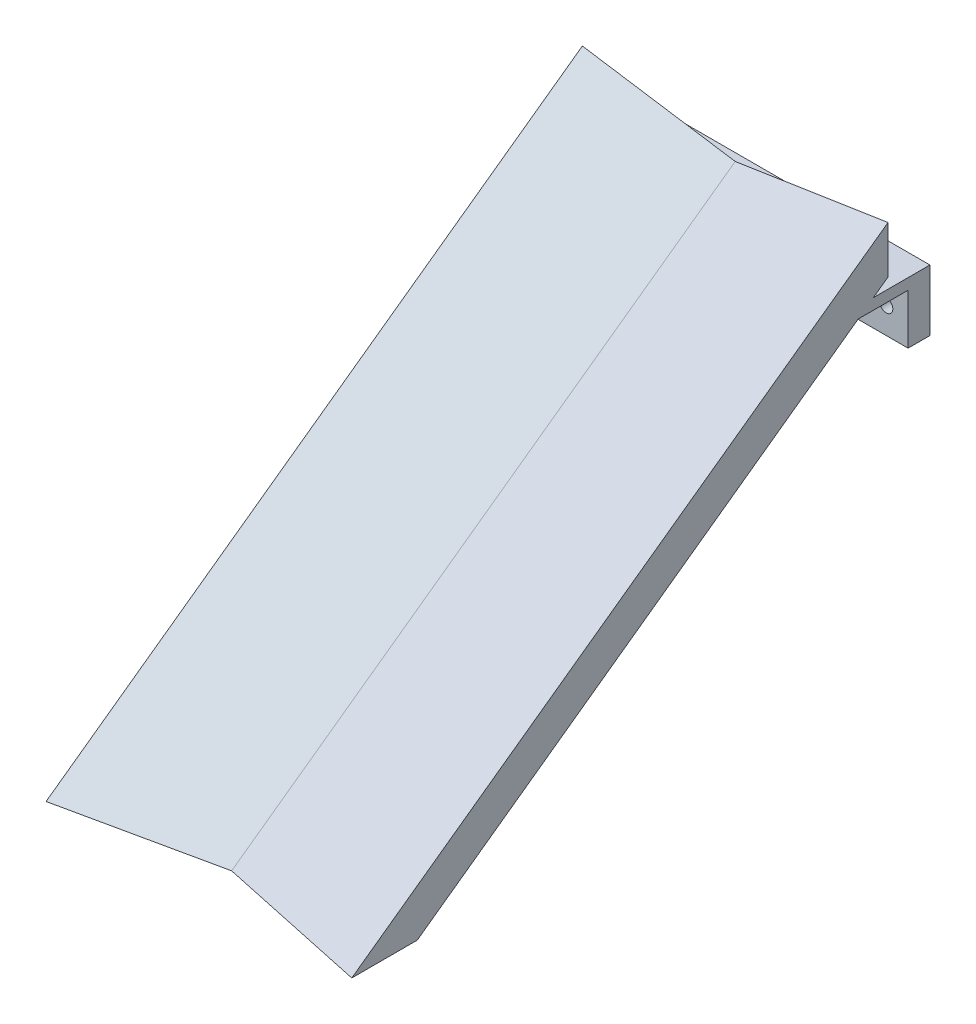
ISO-10303-21;
HEADER;
FILE_DESCRIPTION(('STEP AP214'),'2;1');
FILE_NAME('part.step','',(''),(''),'','','');
FILE_SCHEMA(('AUTOMOTIVE_DESIGN { 1 0 10303 214 1 1 1 1 }'));
ENDSEC;
DATA;
#1=APPLICATION_CONTEXT('core data for automotive mechanical design processes');
#2=APPLICATION_PROTOCOL_DEFINITION('international standard','automotive_design',2000,#1);
#3=PRODUCT_CONTEXT('',#1,'mechanical');
#4=PRODUCT('Part','Part','',(#3));
#5=PRODUCT_RELATED_PRODUCT_CATEGORY('part','',(#4));
#6=PRODUCT_DEFINITION_FORMATION('','',#4);
#7=PRODUCT_DEFINITION_CONTEXT('part definition',#1,'design');
#8=PRODUCT_DEFINITION('design','',#6,#7);
#9=PRODUCT_DEFINITION_SHAPE('','',#8);
#10=(LENGTH_UNIT() NAMED_UNIT(*) SI_UNIT(.MILLI.,.METRE.));
#11=(NAMED_UNIT(*) PLANE_ANGLE_UNIT() SI_UNIT($,.RADIAN.));
#12=(NAMED_UNIT(*) SI_UNIT($,.STERADIAN.) SOLID_ANGLE_UNIT());
#13=UNCERTAINTY_MEASURE_WITH_UNIT(LENGTH_MEASURE(1.E-05),#10,'distance_accuracy_value','');
#14=(GEOMETRIC_REPRESENTATION_CONTEXT(3) GLOBAL_UNCERTAINTY_ASSIGNED_CONTEXT((#13)) GLOBAL_UNIT_ASSIGNED_CONTEXT((#10,
#11,#12)) REPRESENTATION_CONTEXT('',''));
#15=CARTESIAN_POINT('',(0.,0.,0.));
#16=DIRECTION('',(0.,0.,1.));
#17=DIRECTION('',(1.,0.,0.));
#18=AXIS2_PLACEMENT_3D('',#15,#16,#17);
#19=CARTESIAN_POINT('',(-9.99999999999998,0.,220.));
#20=DIRECTION('',(0.,0.811534341451494,0.584304725845076));
#21=DIRECTION('',(0.,-0.584304725845076,0.811534341451494));
#22=AXIS2_PLACEMENT_3D('',#19,#20,#21);
#23=PLANE('',#22);
#24=DIRECTION('',(0.,0.584304725845076,-0.811534341451494));
#25=VECTOR('',#24,1.);
#26=CARTESIAN_POINT('',(0.,104.32033719705,75.1106427818757));
#27=LINE('',#26,#25);
#28=CARTESIAN_POINT('',(0.,150.4,11.1111111111112));
#29=VERTEX_POINT('',#28);
#30=CARTESIAN_POINT('',(0.,155.244637012322,4.38244859399657));
#31=VERTEX_POINT('',#30);
#32=EDGE_CURVE('E217',#29,#31,#27,.T.);
#33=ORIENTED_EDGE('',*,*,#32,.T.);
#34=DIRECTION('',(1.,0.,0.));
#35=VECTOR('',#34,1.);
#36=CARTESIAN_POINT('',(-40.0000000000001,155.244637012322,4.38244859399657));
#37=LINE('',#36,#35);
#38=CARTESIAN_POINT('',(140.,155.244637012322,4.38244859399657));
#39=VERTEX_POINT('',#38);
#40=EDGE_CURVE('E200',#31,#39,#37,.T.);
#41=ORIENTED_EDGE('',*,*,#40,.T.);
#42=DIRECTION('',(0.,-0.584304725845076,0.811534341451494));
#43=VECTOR('',#42,1.);
#44=CARTESIAN_POINT('',(140.,0.,220.));
#45=LINE('',#44,#43);
#46=CARTESIAN_POINT('',(140.,150.4,11.111111111111));
#47=VERTEX_POINT('',#46);
#48=EDGE_CURVE('E209',#39,#47,#45,.T.);
#49=ORIENTED_EDGE('',*,*,#48,.T.);
#50=DIRECTION('',(-1.,0.,0.));
#51=VECTOR('',#50,1.);
#52=CARTESIAN_POINT('',(140.,150.4,11.1111111111112));
#53=LINE('',#52,#51);
#54=EDGE_CURVE('E249',#47,#29,#53,.T.);
#55=ORIENTED_EDGE('',*,*,#54,.T.);
#56=EDGE_LOOP('',(#33,#41,#49,#55));
#57=FACE_BOUND('',#56,.T.);
#58=ADVANCED_FACE('F110',(#57),#23,.F.);
#59=CARTESIAN_POINT('',(140.,0.,0.));
#60=DIRECTION('',(0.,1.,0.));
#61=DIRECTION('',(0.,0.,1.));
#62=AXIS2_PLACEMENT_3D('',#59,#60,#61);
#63=PLANE('',#62);
#64=DIRECTION('',(-0.97780241407741,0.,-0.209529088730873));
#65=VECTOR('',#64,1.);
#66=CARTESIAN_POINT('',(20.8042090518905,0.,224.458044796834));
#67=LINE('',#66,#65);
#68=CARTESIAN_POINT('',(140.,0.,250.));
#69=VERTEX_POINT('',#68);
#70=CARTESIAN_POINT('',(70.,0.,235.));
#71=VERTEX_POINT('',#70);
#72=EDGE_CURVE('E214',#69,#71,#67,.T.);
#73=ORIENTED_EDGE('',*,*,#72,.T.);
#74=DIRECTION('',(0.97780241407741,0.,-0.209529088730873));
#75=VECTOR('',#74,1.);
#76=CARTESIAN_POINT('',(119.19579094811,0.,224.458044796834));
#77=LINE('',#76,#75);
#78=CARTESIAN_POINT('',(0.,0.,250.));
#79=VERTEX_POINT('',#78);
#80=EDGE_CURVE('E269',#79,#71,#77,.T.);
#81=ORIENTED_EDGE('',*,*,#80,.F.);
#82=DIRECTION('',(0.,0.,-1.));
#83=VECTOR('',#82,1.);
#84=CARTESIAN_POINT('',(0.,0.,0.));
#85=LINE('',#84,#83);
#86=CARTESIAN_POINT('',(0.,0.,220.));
#87=VERTEX_POINT('',#86);
#88=EDGE_CURVE('E227',#79,#87,#85,.T.);
#89=ORIENTED_EDGE('',*,*,#88,.T.);
#90=DIRECTION('',(1.,0.,0.));
#91=VECTOR('',#90,1.);
#92=CARTESIAN_POINT('',(-9.99999999999998,0.,220.));
#93=LINE('',#92,#91);
#94=CARTESIAN_POINT('',(140.,0.,220.));
#95=VERTEX_POINT('',#94);
#96=EDGE_CURVE('E231',#87,#95,#93,.T.);
#97=ORIENTED_EDGE('',*,*,#96,.T.);
#98=DIRECTION('',(0.,0.,-1.));
#99=VECTOR('',#98,1.);
#100=CARTESIAN_POINT('',(140.,0.,0.));
#101=LINE('',#100,#99);
#102=EDGE_CURVE('E218',#69,#95,#101,.T.);
#103=ORIENTED_EDGE('',*,*,#102,.F.);
#104=EDGE_LOOP('',(#73,#81,#89,#97,#103));
#105=FACE_BOUND('',#104,.T.);
#106=ADVANCED_FACE('F112',(#105),#63,.F.);
#107=CARTESIAN_POINT('',(140.,0.,0.));
#108=DIRECTION('',(-1.,0.,0.));
#109=DIRECTION('',(0.,0.,1.));
#110=AXIS2_PLACEMENT_3D('',#107,#108,#109);
#111=PLANE('',#110);
#112=ORIENTED_EDGE('',*,*,#48,.F.);
#113=DIRECTION('',(0.,-1.,0.));
#114=VECTOR('',#113,1.);
#115=CARTESIAN_POINT('',(140.,176.844637012322,4.38244859399658));
#116=LINE('',#115,#114);
#117=CARTESIAN_POINT('',(140.,176.844637012322,4.38244859399658));
#118=VERTEX_POINT('',#117);
#119=EDGE_CURVE('E194',#118,#39,#116,.T.);
#120=ORIENTED_EDGE('',*,*,#119,.F.);
#121=DIRECTION('',(0.,-0.584304725845076,0.811534341451494));
#122=VECTOR('',#121,1.);
#123=CARTESIAN_POINT('',(140.,0.,250.));
#124=LINE('',#123,#122);
#125=EDGE_CURVE('E206',#118,#69,#124,.T.);
#126=ORIENTED_EDGE('',*,*,#125,.T.);
#127=ORIENTED_EDGE('',*,*,#102,.T.);
#128=CARTESIAN_POINT('',(140.,145.4,18.0555555555556));
#129=VERTEX_POINT('',#128);
#130=EDGE_CURVE('E291',#129,#95,#45,.T.);
#131=ORIENTED_EDGE('',*,*,#130,.F.);
#132=DIRECTION('',(0.,0.,1.));
#133=VECTOR('',#132,1.);
#134=CARTESIAN_POINT('',(140.,145.4,-4.79552373042697));
#135=LINE('',#134,#133);
#136=CARTESIAN_POINT('',(140.,145.4,-4.79552373042697));
#137=VERTEX_POINT('',#136);
#138=EDGE_CURVE('E247',#137,#129,#135,.T.);
#139=ORIENTED_EDGE('',*,*,#138,.F.);
#140=DIRECTION('',(0.,1.,0.));
#141=VECTOR('',#140,1.);
#142=CARTESIAN_POINT('',(140.,122.4,-4.79552373042697));
#143=LINE('',#142,#141);
#144=CARTESIAN_POINT('',(140.,122.4,-4.79552373042697));
#145=VERTEX_POINT('',#144);
#146=EDGE_CURVE('E301',#145,#137,#143,.T.);
#147=ORIENTED_EDGE('',*,*,#146,.F.);
#148=DIRECTION('',(0.,0.,1.));
#149=VECTOR('',#148,1.);
#150=CARTESIAN_POINT('',(140.,122.4,-14.795523730427));
#151=LINE('',#150,#149);
#152=CARTESIAN_POINT('',(140.,122.4,-14.795523730427));
#153=VERTEX_POINT('',#152);
#154=EDGE_CURVE('E304',#153,#145,#151,.T.);
#155=ORIENTED_EDGE('',*,*,#154,.F.);
#156=DIRECTION('',(0.,-1.,0.));
#157=VECTOR('',#156,1.);
#158=CARTESIAN_POINT('',(140.,150.4,-14.795523730427));
#159=LINE('',#158,#157);
#160=CARTESIAN_POINT('',(140.,150.4,-14.795523730427));
#161=VERTEX_POINT('',#160);
#162=EDGE_CURVE('E308',#161,#153,#159,.T.);
#163=ORIENTED_EDGE('',*,*,#162,.F.);
#164=DIRECTION('',(0.,0.,-1.));
#165=VECTOR('',#164,1.);
#166=CARTESIAN_POINT('',(140.,150.4,-4.79552373042697));
#167=LINE('',#166,#165);
#168=EDGE_CURVE('E261',#47,#161,#167,.T.);
#169=ORIENTED_EDGE('',*,*,#168,.F.);
#170=EDGE_LOOP('',(#112,#120,#126,#127,#131,#139,#147,#155,#163,#169));
#171=FACE_BOUND('',#170,.T.);
#172=ADVANCED_FACE('F204',(#171),#111,.F.);
#173=CARTESIAN_POINT('',(0.,0.,0.));
#174=DIRECTION('',(-1.,0.,0.));
#175=DIRECTION('',(0.,0.,1.));
#176=AXIS2_PLACEMENT_3D('',#173,#174,#175);
#177=PLANE('',#176);
#178=DIRECTION('',(0.,1.,0.));
#179=VECTOR('',#178,1.);
#180=CARTESIAN_POINT('',(0.,0.,4.38244859399649));
#181=LINE('',#180,#179);
#182=CARTESIAN_POINT('',(0.,176.844637012322,4.38244859399656));
#183=VERTEX_POINT('',#182);
#184=EDGE_CURVE('E126',#31,#183,#181,.T.);
#185=ORIENTED_EDGE('',*,*,#184,.F.);
#186=ORIENTED_EDGE('',*,*,#32,.F.);
#187=DIRECTION('',(0.,0.,-1.));
#188=VECTOR('',#187,1.);
#189=CARTESIAN_POINT('',(0.,150.4,-4.79552373042697));
#190=LINE('',#189,#188);
#191=CARTESIAN_POINT('',(0.,150.4,-14.795523730427));
#192=VERTEX_POINT('',#191);
#193=EDGE_CURVE('E257',#29,#192,#190,.T.);
#194=ORIENTED_EDGE('',*,*,#193,.T.);
#195=DIRECTION('',(0.,-1.,0.));
#196=VECTOR('',#195,1.);
#197=CARTESIAN_POINT('',(0.,150.4,-14.795523730427));
#198=LINE('',#197,#196);
#199=CARTESIAN_POINT('',(0.,122.4,-14.795523730427));
#200=VERTEX_POINT('',#199);
#201=EDGE_CURVE('E321',#192,#200,#198,.T.);
#202=ORIENTED_EDGE('',*,*,#201,.T.);
#203=DIRECTION('',(0.,0.,1.));
#204=VECTOR('',#203,1.);
#205=CARTESIAN_POINT('',(0.,122.4,-14.795523730427));
#206=LINE('',#205,#204);
#207=CARTESIAN_POINT('',(0.,122.4,-4.79552373042697));
#208=VERTEX_POINT('',#207);
#209=EDGE_CURVE('E263',#200,#208,#206,.T.);
#210=ORIENTED_EDGE('',*,*,#209,.T.);
#211=DIRECTION('',(0.,1.,0.));
#212=VECTOR('',#211,1.);
#213=CARTESIAN_POINT('',(0.,122.4,-4.79552373042697));
#214=LINE('',#213,#212);
#215=CARTESIAN_POINT('',(0.,145.4,-4.79552373042697));
#216=VERTEX_POINT('',#215);
#217=EDGE_CURVE('E255',#208,#216,#214,.T.);
#218=ORIENTED_EDGE('',*,*,#217,.T.);
#219=DIRECTION('',(0.,0.,1.));
#220=VECTOR('',#219,1.);
#221=CARTESIAN_POINT('',(0.,145.4,-4.79552373042697));
#222=LINE('',#221,#220);
#223=CARTESIAN_POINT('',(0.,145.4,18.0555555555556));
#224=VERTEX_POINT('',#223);
#225=EDGE_CURVE('E244',#216,#224,#222,.T.);
#226=ORIENTED_EDGE('',*,*,#225,.T.);
#227=EDGE_CURVE('E119',#87,#224,#27,.T.);
#228=ORIENTED_EDGE('',*,*,#227,.F.);
#229=ORIENTED_EDGE('',*,*,#88,.F.);
#230=DIRECTION('',(0.,-0.584304725845076,0.811534341451494));
#231=VECTOR('',#230,1.);
#232=CARTESIAN_POINT('',(0.,0.,250.));
#233=LINE('',#232,#231);
#234=EDGE_CURVE('E223',#183,#79,#233,.T.);
#235=ORIENTED_EDGE('',*,*,#234,.F.);
#236=EDGE_LOOP('',(#185,#186,#194,#202,#210,#218,#226,#228,#229,#235));
#237=FACE_BOUND('',#236,.T.);
#238=ADVANCED_FACE('F252',(#237),#177,.T.);
#239=ORIENTED_EDGE('',*,*,#227,.T.);
#240=DIRECTION('',(-1.,0.,0.));
#241=VECTOR('',#240,1.);
#242=CARTESIAN_POINT('',(140.,145.4,18.0555555555556));
#243=LINE('',#242,#241);
#244=EDGE_CURVE('E133',#129,#224,#243,.T.);
#245=ORIENTED_EDGE('',*,*,#244,.F.);
#246=ORIENTED_EDGE('',*,*,#130,.T.);
#247=ORIENTED_EDGE('',*,*,#96,.F.);
#248=EDGE_LOOP('',(#239,#245,#246,#247));
#249=FACE_BOUND('',#248,.T.);
#250=ADVANCED_FACE('F235',(#249),#23,.F.);
#251=CARTESIAN_POINT('',(70.,172.888065331928,-5.12231296101159));
#252=DIRECTION('',(-0.124238097241817,0.805246926567333,0.57977778712848));
#253=DIRECTION('',(0.,-0.584304725845076,0.811534341451494));
#254=AXIS2_PLACEMENT_3D('',#251,#252,#253);
#255=PLANE('',#254);
#256=DIRECTION('',(0.988306317934771,0.15248154619565,0.));
#257=VECTOR('',#256,1.);
#258=CARTESIAN_POINT('',(71.0312942147776,166.203750976888,4.38244859399657));
#259=LINE('',#258,#257);
#260=CARTESIAN_POINT('',(70.,166.044637012322,4.38244859399657));
#261=VERTEX_POINT('',#260);
#262=EDGE_CURVE('E191',#261,#118,#259,.T.);
#263=ORIENTED_EDGE('',*,*,#262,.F.);
#264=DIRECTION('',(0.,-0.584304725845076,0.811534341451494));
#265=VECTOR('',#264,1.);
#266=CARTESIAN_POINT('',(70.,172.888065331928,-5.12231296101159));
#267=LINE('',#266,#265);
#268=EDGE_CURVE('E288',#261,#71,#267,.T.);
#269=ORIENTED_EDGE('',*,*,#268,.T.);
#270=ORIENTED_EDGE('',*,*,#72,.F.);
#271=ORIENTED_EDGE('',*,*,#125,.F.);
#272=EDGE_LOOP('',(#263,#269,#270,#271));
#273=FACE_BOUND('',#272,.T.);
#274=ADVANCED_FACE('F212',(#273),#255,.T.);
#275=CARTESIAN_POINT('',(70.,172.888065331928,-5.12231296101159));
#276=DIRECTION('',(-0.124238097241817,-0.805246926567333,-0.57977778712848));
#277=DIRECTION('',(0.,0.584304725845076,-0.811534341451494));
#278=AXIS2_PLACEMENT_3D('',#275,#276,#277);
#279=PLANE('',#278);
#280=ORIENTED_EDGE('',*,*,#268,.F.);
#281=DIRECTION('',(-0.988306317934771,0.15248154619565,0.));
#282=VECTOR('',#281,1.);
#283=CARTESIAN_POINT('',(68.9687057852224,166.203750976888,4.38244859399657));
#284=LINE('',#283,#282);
#285=EDGE_CURVE('E57',#261,#183,#284,.T.);
#286=ORIENTED_EDGE('',*,*,#285,.T.);
#287=ORIENTED_EDGE('',*,*,#234,.T.);
#288=ORIENTED_EDGE('',*,*,#80,.T.);
#289=EDGE_LOOP('',(#280,#286,#287,#288));
#290=FACE_BOUND('',#289,.T.);
#291=ADVANCED_FACE('F387',(#290),#279,.F.);
#292=CARTESIAN_POINT('',(140.,150.4,-4.79552373042697));
#293=DIRECTION('',(0.,1.,0.));
#294=DIRECTION('',(0.,0.,1.));
#295=AXIS2_PLACEMENT_3D('',#292,#293,#294);
#296=PLANE('',#295);
#297=ORIENTED_EDGE('',*,*,#193,.F.);
#298=ORIENTED_EDGE('',*,*,#54,.F.);
#299=ORIENTED_EDGE('',*,*,#168,.T.);
#300=DIRECTION('',(-1.,0.,0.));
#301=VECTOR('',#300,1.);
#302=CARTESIAN_POINT('',(140.,150.4,-14.795523730427));
#303=LINE('',#302,#301);
#304=EDGE_CURVE('E279',#161,#192,#303,.T.);
#305=ORIENTED_EDGE('',*,*,#304,.T.);
#306=EDGE_LOOP('',(#297,#298,#299,#305));
#307=FACE_BOUND('',#306,.T.);
#308=ADVANCED_FACE('F337',(#307),#296,.T.);
#309=CARTESIAN_POINT('',(140.,145.4,-4.79552373042697));
#310=DIRECTION('',(0.,-1.,0.));
#311=DIRECTION('',(0.,0.,-1.));
#312=AXIS2_PLACEMENT_3D('',#309,#310,#311);
#313=PLANE('',#312);
#314=ORIENTED_EDGE('',*,*,#225,.F.);
#315=DIRECTION('',(-1.,0.,0.));
#316=VECTOR('',#315,1.);
#317=CARTESIAN_POINT('',(140.,145.4,-4.79552373042697));
#318=LINE('',#317,#316);
#319=EDGE_CURVE('E250',#137,#216,#318,.T.);
#320=ORIENTED_EDGE('',*,*,#319,.F.);
#321=ORIENTED_EDGE('',*,*,#138,.T.);
#322=ORIENTED_EDGE('',*,*,#244,.T.);
#323=EDGE_LOOP('',(#314,#320,#321,#322));
#324=FACE_BOUND('',#323,.T.);
#325=ADVANCED_FACE('F243',(#324),#313,.T.);
#326=CARTESIAN_POINT('',(140.,122.4,-4.79552373042697));
#327=DIRECTION('',(0.,0.,1.));
#328=DIRECTION('',(1.,0.,0.));
#329=AXIS2_PLACEMENT_3D('',#326,#327,#328);
#330=PLANE('',#329);
#331=CARTESIAN_POINT('',(130.,134.4,-4.79552373042696));
#332=DIRECTION('',(0.,0.,-1.));
#333=DIRECTION('',(-1.,0.,0.));
#334=AXIS2_PLACEMENT_3D('',#331,#332,#333);
#335=CIRCLE('',#334,2.99999999999999);
#336=CARTESIAN_POINT('',(127.,134.4,-4.79552373042696));
#337=VERTEX_POINT('',#336);
#338=EDGE_CURVE('E324',#337,#337,#335,.T.);
#339=ORIENTED_EDGE('',*,*,#338,.T.);
#340=EDGE_LOOP('',(#339));
#341=FACE_BOUND('',#340,.T.);
#342=CARTESIAN_POINT('',(10.,134.4,-4.79552373042696));
#343=DIRECTION('',(0.,0.,-1.));
#344=DIRECTION('',(-1.,0.,0.));
#345=AXIS2_PLACEMENT_3D('',#342,#343,#344);
#346=CIRCLE('',#345,3.);
#347=CARTESIAN_POINT('',(7.00000000000001,134.4,-4.79552373042696));
#348=VERTEX_POINT('',#347);
#349=EDGE_CURVE('E318',#348,#348,#346,.T.);
#350=ORIENTED_EDGE('',*,*,#349,.T.);
#351=EDGE_LOOP('',(#350));
#352=FACE_BOUND('',#351,.T.);
#353=ORIENTED_EDGE('',*,*,#217,.F.);
#354=DIRECTION('',(-1.,0.,0.));
#355=VECTOR('',#354,1.);
#356=CARTESIAN_POINT('',(140.,122.4,-4.79552373042697));
#357=LINE('',#356,#355);
#358=EDGE_CURVE('E273',#145,#208,#357,.T.);
#359=ORIENTED_EDGE('',*,*,#358,.F.);
#360=ORIENTED_EDGE('',*,*,#146,.T.);
#361=ORIENTED_EDGE('',*,*,#319,.T.);
#362=EDGE_LOOP('',(#353,#359,#360,#361));
#363=FACE_BOUND('',#362,.T.);
#364=ADVANCED_FACE('F332',(#341,#352,#363),#330,.T.);
#365=CARTESIAN_POINT('',(140.,122.4,-14.795523730427));
#366=DIRECTION('',(0.,-1.,0.));
#367=DIRECTION('',(0.,0.,-1.));
#368=AXIS2_PLACEMENT_3D('',#365,#366,#367);
#369=PLANE('',#368);
#370=ORIENTED_EDGE('',*,*,#209,.F.);
#371=DIRECTION('',(-1.,0.,0.));
#372=VECTOR('',#371,1.);
#373=CARTESIAN_POINT('',(140.,122.4,-14.795523730427));
#374=LINE('',#373,#372);
#375=EDGE_CURVE('E276',#153,#200,#374,.T.);
#376=ORIENTED_EDGE('',*,*,#375,.F.);
#377=ORIENTED_EDGE('',*,*,#154,.T.);
#378=ORIENTED_EDGE('',*,*,#358,.T.);
#379=EDGE_LOOP('',(#370,#376,#377,#378));
#380=FACE_BOUND('',#379,.T.);
#381=ADVANCED_FACE('F329',(#380),#369,.T.);
#382=CARTESIAN_POINT('',(140.,150.4,-14.795523730427));
#383=DIRECTION('',(0.,0.,-1.));
#384=DIRECTION('',(0.,1.,0.));
#385=AXIS2_PLACEMENT_3D('',#382,#383,#384);
#386=PLANE('',#385);
#387=CARTESIAN_POINT('',(130.,134.4,-14.795523730427));
#388=DIRECTION('',(0.,0.,-1.));
#389=DIRECTION('',(-1.,0.,0.));
#390=AXIS2_PLACEMENT_3D('',#387,#388,#389);
#391=CIRCLE('',#390,2.99999999999999);
#392=CARTESIAN_POINT('',(127.,134.4,-14.795523730427));
#393=VERTEX_POINT('',#392);
#394=EDGE_CURVE('E348',#393,#393,#391,.T.);
#395=ORIENTED_EDGE('',*,*,#394,.F.);
#396=EDGE_LOOP('',(#395));
#397=FACE_BOUND('',#396,.T.);
#398=CARTESIAN_POINT('',(10.,134.4,-14.795523730427));
#399=DIRECTION('',(0.,0.,-1.));
#400=DIRECTION('',(-1.,0.,0.));
#401=AXIS2_PLACEMENT_3D('',#398,#399,#400);
#402=CIRCLE('',#401,3.);
#403=CARTESIAN_POINT('',(7.00000000000001,134.4,-14.795523730427));
#404=VERTEX_POINT('',#403);
#405=EDGE_CURVE('E351',#404,#404,#402,.T.);
#406=ORIENTED_EDGE('',*,*,#405,.F.);
#407=EDGE_LOOP('',(#406));
#408=FACE_BOUND('',#407,.T.);
#409=ORIENTED_EDGE('',*,*,#201,.F.);
#410=ORIENTED_EDGE('',*,*,#304,.F.);
#411=ORIENTED_EDGE('',*,*,#162,.T.);
#412=ORIENTED_EDGE('',*,*,#375,.T.);
#413=EDGE_LOOP('',(#409,#410,#411,#412));
#414=FACE_BOUND('',#413,.T.);
#415=ADVANCED_FACE('F335',(#397,#408,#414),#386,.T.);
#416=CARTESIAN_POINT('',(10.,134.4,-4.79552373042696));
#417=DIRECTION('',(0.,0.,-1.));
#418=DIRECTION('',(-1.,0.,0.));
#419=AXIS2_PLACEMENT_3D('',#416,#417,#418);
#420=CYLINDRICAL_SURFACE('',#419,3.);
#421=ORIENTED_EDGE('',*,*,#349,.F.);
#422=EDGE_LOOP('',(#421));
#423=FACE_BOUND('',#422,.T.);
#424=ORIENTED_EDGE('',*,*,#405,.T.);
#425=EDGE_LOOP('',(#424));
#426=FACE_BOUND('',#425,.T.);
#427=ADVANCED_FACE('F361',(#423,#426),#420,.F.);
#428=CARTESIAN_POINT('',(130.,134.4,-4.79552373042696));
#429=DIRECTION('',(0.,0.,-1.));
#430=DIRECTION('',(-1.,0.,0.));
#431=AXIS2_PLACEMENT_3D('',#428,#429,#430);
#432=CYLINDRICAL_SURFACE('',#431,2.99999999999999);
#433=ORIENTED_EDGE('',*,*,#338,.F.);
#434=EDGE_LOOP('',(#433));
#435=FACE_BOUND('',#434,.T.);
#436=ORIENTED_EDGE('',*,*,#394,.T.);
#437=EDGE_LOOP('',(#436));
#438=FACE_BOUND('',#437,.T.);
#439=ADVANCED_FACE('F363',(#435,#438),#432,.F.);
#440=CARTESIAN_POINT('',(-40.0000000000001,176.844637012322,4.38244859399658));
#441=DIRECTION('',(0.,0.,1.));
#442=DIRECTION('',(0.,-1.,0.));
#443=AXIS2_PLACEMENT_3D('',#440,#441,#442);
#444=PLANE('',#443);
#445=ORIENTED_EDGE('',*,*,#184,.T.);
#446=ORIENTED_EDGE('',*,*,#285,.F.);
#447=ORIENTED_EDGE('',*,*,#262,.T.);
#448=ORIENTED_EDGE('',*,*,#119,.T.);
#449=ORIENTED_EDGE('',*,*,#40,.F.);
#450=EDGE_LOOP('',(#445,#446,#447,#448,#449));
#451=FACE_BOUND('',#450,.T.);
#452=ADVANCED_FACE('F193',(#451),#444,.F.);
#453=CLOSED_SHELL('',(#58,#106,#172,#238,#250,#274,#291,#308,#325,#364,#381,#415,#427,#439,#452));
#454=MANIFOLD_SOLID_BREP('B6',#453);
#455=ADVANCED_BREP_SHAPE_REPRESENTATION('',(#18,#454),#14);
#456=SHAPE_DEFINITION_REPRESENTATION(#9,#455);
ENDSEC;
END-ISO-10303-21;
